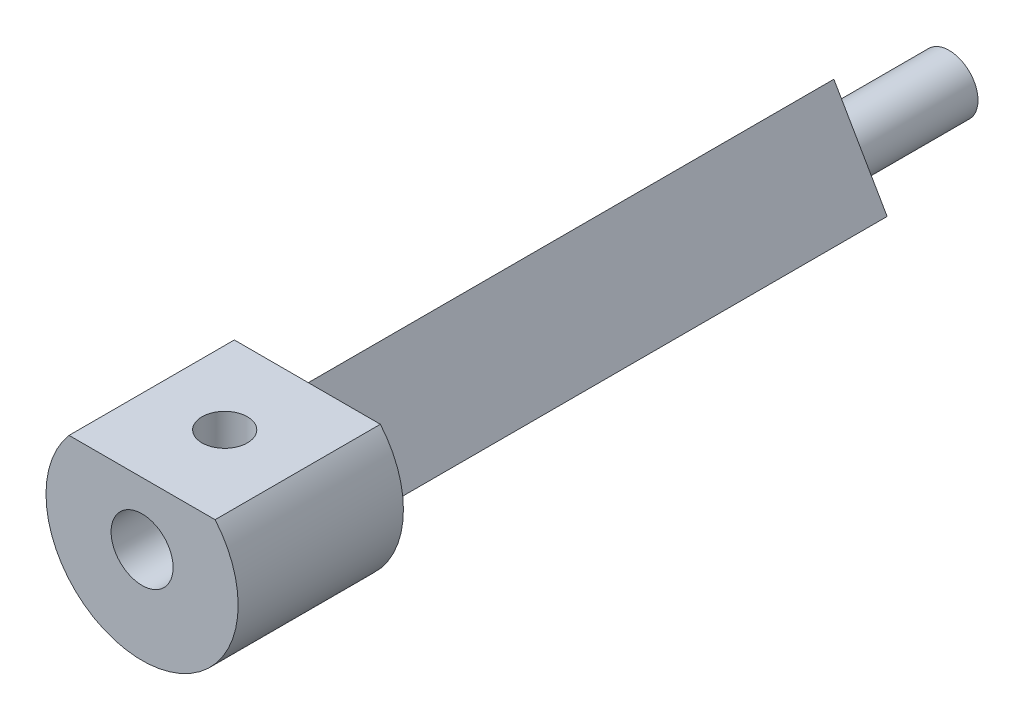
ISO-10303-21;
HEADER;
FILE_DESCRIPTION(('STEP AP214'),'2;1');
FILE_NAME('part.step','',(''),(''),'','','');
FILE_SCHEMA(('AUTOMOTIVE_DESIGN { 1 0 10303 214 1 1 1 1 }'));
ENDSEC;
DATA;
#1=APPLICATION_CONTEXT('core data for automotive mechanical design processes');
#2=APPLICATION_PROTOCOL_DEFINITION('international standard','automotive_design',2000,#1);
#3=PRODUCT_CONTEXT('',#1,'mechanical');
#4=PRODUCT('Part','Part','',(#3));
#5=PRODUCT_RELATED_PRODUCT_CATEGORY('part','',(#4));
#6=PRODUCT_DEFINITION_FORMATION('','',#4);
#7=PRODUCT_DEFINITION_CONTEXT('part definition',#1,'design');
#8=PRODUCT_DEFINITION('design','',#6,#7);
#9=PRODUCT_DEFINITION_SHAPE('','',#8);
#10=(LENGTH_UNIT() NAMED_UNIT(*) SI_UNIT(.MILLI.,.METRE.));
#11=(NAMED_UNIT(*) PLANE_ANGLE_UNIT() SI_UNIT($,.RADIAN.));
#12=(NAMED_UNIT(*) SI_UNIT($,.STERADIAN.) SOLID_ANGLE_UNIT());
#13=UNCERTAINTY_MEASURE_WITH_UNIT(LENGTH_MEASURE(1.E-05),#10,'distance_accuracy_value','');
#14=(GEOMETRIC_REPRESENTATION_CONTEXT(3) GLOBAL_UNCERTAINTY_ASSIGNED_CONTEXT((#13)) GLOBAL_UNIT_ASSIGNED_CONTEXT((#10,
#11,#12)) REPRESENTATION_CONTEXT('',''));
#15=CARTESIAN_POINT('',(0.,0.,0.));
#16=DIRECTION('',(0.,0.,1.));
#17=DIRECTION('',(1.,0.,0.));
#18=AXIS2_PLACEMENT_3D('',#15,#16,#17);
#19=CARTESIAN_POINT('',(0.,0.,0.));
#20=DIRECTION('',(0.,0.,1.));
#21=DIRECTION('',(1.,0.,0.));
#22=AXIS2_PLACEMENT_3D('',#19,#20,#21);
#23=PLANE('',#22);
#24=CARTESIAN_POINT('',(0.,0.,0.));
#25=DIRECTION('',(0.,0.,1.));
#26=DIRECTION('',(1.,0.,0.));
#27=AXIS2_PLACEMENT_3D('',#24,#25,#26);
#28=CIRCLE('',#27,6.35);
#29=CARTESIAN_POINT('',(-4.82609120903845,4.12690485013185,0.));
#30=VERTEX_POINT('',#29);
#31=CARTESIAN_POINT('',(4.82609120903845,4.12690485013185,0.));
#32=VERTEX_POINT('',#31);
#33=EDGE_CURVE('E143',#30,#32,#28,.T.);
#34=ORIENTED_EDGE('',*,*,#33,.F.);
#35=DIRECTION('',(1.,0.,0.));
#36=VECTOR('',#35,1.);
#37=CARTESIAN_POINT('',(0.,4.12690485013185,0.));
#38=LINE('',#37,#36);
#39=EDGE_CURVE('E54',#30,#32,#38,.T.);
#40=ORIENTED_EDGE('',*,*,#39,.T.);
#41=EDGE_LOOP('',(#34,#40));
#42=FACE_BOUND('',#41,.T.);
#43=DIRECTION('',(0.5,0.866025403784439,0.));
#44=VECTOR('',#43,1.);
#45=CARTESIAN_POINT('',(-3.51952724097996,-2.032,0.));
#46=LINE('',#45,#44);
#47=CARTESIAN_POINT('',(-3.51952724097996,-2.032,0.));
#48=VERTEX_POINT('',#47);
#49=CARTESIAN_POINT('',(0.,4.064,0.));
#50=VERTEX_POINT('',#49);
#51=EDGE_CURVE('E62',#48,#50,#46,.T.);
#52=ORIENTED_EDGE('',*,*,#51,.F.);
#53=DIRECTION('',(-1.,0.,0.));
#54=VECTOR('',#53,1.);
#55=CARTESIAN_POINT('',(3.51952724097996,-2.032,0.));
#56=LINE('',#55,#54);
#57=CARTESIAN_POINT('',(3.51952724097996,-2.032,0.));
#58=VERTEX_POINT('',#57);
#59=EDGE_CURVE('E111',#58,#48,#56,.T.);
#60=ORIENTED_EDGE('',*,*,#59,.F.);
#61=DIRECTION('',(0.5,-0.866025403784439,0.));
#62=VECTOR('',#61,1.);
#63=CARTESIAN_POINT('',(0.,4.064,0.));
#64=LINE('',#63,#62);
#65=EDGE_CURVE('E66',#50,#58,#64,.T.);
#66=ORIENTED_EDGE('',*,*,#65,.F.);
#67=EDGE_LOOP('',(#52,#60,#66));
#68=FACE_BOUND('',#67,.T.);
#69=ADVANCED_FACE('F39',(#42,#68),#23,.F.);
#70=CARTESIAN_POINT('',(0.,0.,10.922));
#71=DIRECTION('',(0.,0.,-1.));
#72=DIRECTION('',(-1.,0.,0.));
#73=AXIS2_PLACEMENT_3D('',#70,#71,#72);
#74=CYLINDRICAL_SURFACE('',#73,6.35);
#75=CARTESIAN_POINT('',(0.,0.,10.922));
#76=DIRECTION('',(0.,0.,1.));
#77=DIRECTION('',(1.,0.,0.));
#78=AXIS2_PLACEMENT_3D('',#75,#76,#77);
#79=CIRCLE('',#78,6.35);
#80=CARTESIAN_POINT('',(-4.82609120903845,4.12690485013185,10.922));
#81=VERTEX_POINT('',#80);
#82=CARTESIAN_POINT('',(4.82609120903845,4.12690485013185,10.922));
#83=VERTEX_POINT('',#82);
#84=EDGE_CURVE('E144',#81,#83,#79,.T.);
#85=ORIENTED_EDGE('',*,*,#84,.F.);
#86=DIRECTION('',(0.,0.,1.));
#87=VECTOR('',#86,1.);
#88=CARTESIAN_POINT('',(-4.82609120903845,4.12690485013185,-4.318));
#89=LINE('',#88,#87);
#90=EDGE_CURVE('E136',#30,#81,#89,.T.);
#91=ORIENTED_EDGE('',*,*,#90,.F.);
#92=ORIENTED_EDGE('',*,*,#33,.T.);
#93=DIRECTION('',(0.,0.,-1.));
#94=VECTOR('',#93,1.);
#95=CARTESIAN_POINT('',(4.82609120903845,4.12690485013185,10.922));
#96=LINE('',#95,#94);
#97=EDGE_CURVE('E139',#32,#83,#96,.F.);
#98=ORIENTED_EDGE('',*,*,#97,.T.);
#99=EDGE_LOOP('',(#85,#91,#92,#98));
#100=FACE_BOUND('',#99,.T.);
#101=ADVANCED_FACE('F41',(#100),#74,.T.);
#102=CARTESIAN_POINT('',(0.,0.,10.922));
#103=DIRECTION('',(0.,0.,1.));
#104=DIRECTION('',(1.,0.,0.));
#105=AXIS2_PLACEMENT_3D('',#102,#103,#104);
#106=PLANE('',#105);
#107=CARTESIAN_POINT('',(0.,0.,10.922));
#108=DIRECTION('',(0.,0.,1.));
#109=DIRECTION('',(1.,0.,0.));
#110=AXIS2_PLACEMENT_3D('',#107,#108,#109);
#111=CIRCLE('',#110,2.05);
#112=CARTESIAN_POINT('',(2.05,0.,10.922));
#113=VERTEX_POINT('',#112);
#114=EDGE_CURVE('E115',#113,#113,#111,.T.);
#115=ORIENTED_EDGE('',*,*,#114,.F.);
#116=EDGE_LOOP('',(#115));
#117=FACE_BOUND('',#116,.T.);
#118=DIRECTION('',(1.,0.,0.));
#119=VECTOR('',#118,1.);
#120=CARTESIAN_POINT('',(-4.82609120903845,4.12690485013185,10.922));
#121=LINE('',#120,#119);
#122=EDGE_CURVE('E133',#81,#83,#121,.T.);
#123=ORIENTED_EDGE('',*,*,#122,.F.);
#124=ORIENTED_EDGE('',*,*,#84,.T.);
#125=EDGE_LOOP('',(#123,#124));
#126=FACE_BOUND('',#125,.T.);
#127=ADVANCED_FACE('F161',(#117,#126),#106,.T.);
#128=CARTESIAN_POINT('',(-4.82609120903845,4.12690485013185,-4.318));
#129=DIRECTION('',(0.,-1.,0.));
#130=DIRECTION('',(0.,0.,-1.));
#131=AXIS2_PLACEMENT_3D('',#128,#129,#130);
#132=PLANE('',#131);
#133=CARTESIAN_POINT('',(0.,4.12690485013185,5.461));
#134=DIRECTION('',(0.,1.,0.));
#135=DIRECTION('',(0.,0.,1.));
#136=AXIS2_PLACEMENT_3D('',#133,#134,#135);
#137=CIRCLE('',#136,1.5);
#138=CARTESIAN_POINT('',(0.,4.12690485013185,6.961));
#139=VERTEX_POINT('',#138);
#140=EDGE_CURVE('E129',#139,#139,#137,.T.);
#141=ORIENTED_EDGE('',*,*,#140,.F.);
#142=EDGE_LOOP('',(#141));
#143=FACE_BOUND('',#142,.T.);
#144=ORIENTED_EDGE('',*,*,#39,.F.);
#145=ORIENTED_EDGE('',*,*,#90,.T.);
#146=ORIENTED_EDGE('',*,*,#122,.T.);
#147=ORIENTED_EDGE('',*,*,#97,.F.);
#148=EDGE_LOOP('',(#144,#145,#146,#147));
#149=FACE_BOUND('',#148,.T.);
#150=ADVANCED_FACE('F159',(#143,#149),#132,.F.);
#151=CARTESIAN_POINT('',(0.,-0.953095149868148,5.461));
#152=DIRECTION('',(0.,1.,0.));
#153=DIRECTION('',(0.,0.,1.));
#154=AXIS2_PLACEMENT_3D('',#151,#152,#153);
#155=CYLINDRICAL_SURFACE('',#154,1.5);
#156=CARTESIAN_POINT('',(0.,2.05,6.961));
#157=CARTESIAN_POINT('',(-0.0736645541699376,2.04999557455054,6.96099536487032));
#158=CARTESIAN_POINT('',(-0.147451361580434,2.04598708706443,6.95552985480854));
#159=CARTESIAN_POINT('',(-0.292720171427361,2.03031628176041,6.93400264589157));
#160=CARTESIAN_POINT('',(-0.364195790279562,2.01863439721989,6.91791385773748));
#161=CARTESIAN_POINT('',(-0.502351269043641,1.98874583853753,6.87621015882617));
#162=CARTESIAN_POINT('',(-0.569056984261829,1.97057814890178,6.85065213123984));
#163=CARTESIAN_POINT('',(-0.696820466780421,1.92910828401678,6.79119240013698));
#164=CARTESIAN_POINT('',(-0.757879974929624,1.90580769889566,6.75729328024158));
#165=CARTESIAN_POINT('',(-0.878974600164129,1.85327996587474,6.67881635944393));
#166=CARTESIAN_POINT('',(-0.938407453909167,1.82370598176577,6.63354625481528));
#167=CARTESIAN_POINT('',(-1.04935746875454,1.76220961079271,6.53540515478497));
#168=CARTESIAN_POINT('',(-1.10086192304519,1.73028357291087,6.48252221546021));
#169=CARTESIAN_POINT('',(-1.20473615097505,1.66004618595591,6.35896326977443));
#170=CARTESIAN_POINT('',(-1.25534711008369,1.62169397672011,6.28682405496822));
#171=CARTESIAN_POINT('',(-1.34385567293754,1.54913319052267,6.13322299041084));
#172=CARTESIAN_POINT('',(-1.38177233083954,1.5149184529776,6.05177536135073));
#173=CARTESIAN_POINT('',(-1.43291459132733,1.46631010290269,5.90871456900897));
#174=CARTESIAN_POINT('',(-1.45015813606169,1.4491081113302,5.84950503166973));
#175=CARTESIAN_POINT('',(-1.47735605187029,1.42137280086756,5.72798008652806));
#176=CARTESIAN_POINT('',(-1.4873267292953,1.41082457094183,5.66567196341169));
#177=CARTESIAN_POINT('',(-1.49933424266877,1.39806424591683,5.53891666053465));
#178=CARTESIAN_POINT('',(-1.50131036964724,1.39591594223184,5.4744568470837));
#179=CARTESIAN_POINT('',(-1.49697487005051,1.40056141611663,5.34612505475285));
#180=CARTESIAN_POINT('',(-1.49065746079277,1.40736143292628,5.28225351733047));
#181=CARTESIAN_POINT('',(-1.46914421467263,1.42981581835315,5.15023178006344));
#182=CARTESIAN_POINT('',(-1.45304431394653,1.44636569534487,5.0823888526529));
#183=CARTESIAN_POINT('',(-1.41241800405743,1.48606089204735,4.95128361752539));
#184=CARTESIAN_POINT('',(-1.38787183385895,1.50922165684335,4.88803247688767));
#185=CARTESIAN_POINT('',(-1.32149425773126,1.56803362426462,4.7456054484429));
#186=CARTESIAN_POINT('',(-1.27662069854312,1.605233434408,4.66849468218742));
#187=CARTESIAN_POINT('',(-1.17456012669744,1.68136246377685,4.5238485386396));
#188=CARTESIAN_POINT('',(-1.1173592530454,1.72029359028535,4.45632408326575));
#189=CARTESIAN_POINT('',(-0.990371112630744,1.79644834867789,4.33085179892645));
#190=CARTESIAN_POINT('',(-0.920423005713052,1.83364149644171,4.27304695505277));
#191=CARTESIAN_POINT('',(-0.76926800522842,1.90199023539516,4.17005319594615));
#192=CARTESIAN_POINT('',(-0.688087552764536,1.9331596052877,4.12483538234152));
#193=CARTESIAN_POINT('',(-0.538207436597272,1.97922123004423,4.05914062240448));
#194=CARTESIAN_POINT('',(-0.471634462119273,1.99623772718083,4.03529332526308));
#195=CARTESIAN_POINT('',(-0.334527315040303,2.02372535847694,3.99705216140614));
#196=CARTESIAN_POINT('',(-0.263996112133561,2.03420133002224,3.98265130768186));
#197=CARTESIAN_POINT('',(-0.12060014532572,2.04772049374847,3.96410319342416));
#198=CARTESIAN_POINT('',(-0.0477275087898625,2.05073519152121,3.95999524047133));
#199=CARTESIAN_POINT('',(0.0977467281938168,2.04895968464559,3.96242177556858));
#200=CARTESIAN_POINT('',(0.170348323545057,2.04416933396684,3.96895646273962));
#201=CARTESIAN_POINT('',(0.30872436576349,2.02774746830803,3.99153937748139));
#202=CARTESIAN_POINT('',(0.374648148974852,2.01653935117606,4.00699926266328));
#203=CARTESIAN_POINT('',(0.502713167981761,1.98848713080471,4.04616175245188));
#204=CARTESIAN_POINT('',(0.56485361051893,1.97164185039048,4.06986607873626));
#205=CARTESIAN_POINT('',(0.689132816852741,1.9318878201279,4.12678136118287));
#206=CARTESIAN_POINT('',(0.750866850830906,1.90859948458405,4.16060507457239));
#207=CARTESIAN_POINT('',(0.867968847215971,1.85827866471816,4.2356532538988));
#208=CARTESIAN_POINT('',(0.923332753094364,1.83124381848865,4.27688239332167));
#209=CARTESIAN_POINT('',(1.03682397286532,1.76985341439226,4.37400685825464));
#210=CARTESIAN_POINT('',(1.09360081170611,1.73506384496132,4.43120532182986));
#211=CARTESIAN_POINT('',(1.19731087491147,1.66518962228043,4.55385800989506));
#212=CARTESIAN_POINT('',(1.24423528561181,1.6301047337781,4.61931954316177));
#213=CARTESIAN_POINT('',(1.32312902288905,1.56656120372554,4.7506770634843));
#214=CARTESIAN_POINT('',(1.35615882476119,1.53779480627221,4.81578433714041));
#215=CARTESIAN_POINT('',(1.41291272063144,1.48581938303921,4.95198740743026));
#216=CARTESIAN_POINT('',(1.43665621646698,1.46259881036972,5.02307033727716));
#217=CARTESIAN_POINT('',(1.46935149073412,1.42965818089487,5.15366776876887));
#218=CARTESIAN_POINT('',(1.48043349891081,1.41807300341028,5.21216597985044));
#219=CARTESIAN_POINT('',(1.49555161797816,1.40212425294941,5.3310034275123));
#220=CARTESIAN_POINT('',(1.49959826077462,1.39774988593686,5.39133977438546));
#221=CARTESIAN_POINT('',(1.5003451977955,1.3969485321308,5.51224125605514));
#222=CARTESIAN_POINT('',(1.49703007298041,1.4005382258501,5.57280660530966));
#223=CARTESIAN_POINT('',(1.48329148070309,1.41507599115702,5.69224363534277));
#224=CARTESIAN_POINT('',(1.47285823479779,1.42603418484414,5.75111287000658));
#225=CARTESIAN_POINT('',(1.44154573019903,1.45776156448447,5.88260815870621));
#226=CARTESIAN_POINT('',(1.41850812555957,1.48045941002889,5.95424268872673));
#227=CARTESIAN_POINT('',(1.36303990157746,1.53168111814911,6.09158590116442));
#228=CARTESIAN_POINT('',(1.33058477026104,1.56022012626716,6.1572785250729));
#229=CARTESIAN_POINT('',(1.24746944408314,1.62785001356672,6.29899881911067));
#230=CARTESIAN_POINT('',(1.19426424774973,1.6677337957351,6.37315634501248));
#231=CARTESIAN_POINT('',(1.07522193889443,1.74685731312829,6.51084071490974));
#232=CARTESIAN_POINT('',(1.00939267395049,1.78609743211258,6.57437411755238));
#233=CARTESIAN_POINT('',(0.877107798536325,1.85413298021575,6.68029193666004));
#234=CARTESIAN_POINT('',(0.812406788660301,1.88359794901534,6.72443243761176));
#235=CARTESIAN_POINT('',(0.675157460670324,1.93702407432252,6.80278399156384));
#236=CARTESIAN_POINT('',(0.602617105963951,1.96099074025875,6.83700499327855));
#237=CARTESIAN_POINT('',(0.462317192011558,1.99830790110585,6.88964391198433));
#238=CARTESIAN_POINT('',(0.395431009217102,2.01270292850566,6.90964837926339));
#239=CARTESIAN_POINT('',(0.258550164418269,2.0348035590171,6.94020215510696));
#240=CARTESIAN_POINT('',(0.188564056942657,2.04252649622795,6.95077596685669));
#241=CARTESIAN_POINT('',(0.0984524426773341,2.04772982798432,6.95789598733901));
#242=CARTESIAN_POINT('',(0.0787929080878813,2.048579801482,6.9590585851658));
#243=CARTESIAN_POINT('',(0.0394251721090294,2.04971551310578,6.96061125748875));
#244=CARTESIAN_POINT('',(0.0197169652405603,2.05000118451044,6.96100124063319));
#245=CARTESIAN_POINT('',(0.,2.05,6.961));
#246=B_SPLINE_CURVE_WITH_KNOTS('',3,(#156,#157,#158,#159,#160,#161,#162,#163,#164,#165,#166,
#167,#168,#169,#170,#171,#172,#173,#174,#175,#176,#177,#178,#179,#180,#181,#182,#183,#184,#185,
#186,#187,#188,#189,#190,#191,#192,#193,#194,#195,#196,#197,#198,#199,#200,#201,#202,#203,#204,
#205,#206,#207,#208,#209,#210,#211,#212,#213,#214,#215,#216,#217,#218,#219,#220,#221,#222,#223,
#224,#225,#226,#227,#228,#229,#230,#231,#232,#233,#234,#235,#236,#237,#238,#239,#240,#241,#242,
#243,#244,#245),.UNSPECIFIED.,.T.,.F.,(4,2,2,2,2,2,2,2,2,2,2,2,2,2,2,2,2,2,2,2,2,2,2,2,2,2,2,2,
2,2,2,2,2,2,2,2,2,2,2,2,2,2,2,2,4),(0.,0.220907485233337,0.442380470099748,0.662544051909396,
0.882639524557006,1.12282543414092,1.3633923681998,1.65048137899578,1.93713751648741,
2.12853026601187,2.31949256748167,2.51190230585804,2.70444627353801,2.91826981751639,
3.1325970669765,3.42110394211627,3.70993692667695,4.00270445801705,4.29479417832145,
4.51209357641629,4.72923206846164,4.9471985358974,5.16516908147474,5.37018833492614,
5.57525042805759,5.79685909676791,6.01860811491735,6.28096376393172,6.54355311721224,
6.77817738021138,7.01230879117284,7.19352509569974,7.37446988601036,7.55579401806688,
7.73736774510938,7.97186478758937,8.20697774023452,8.50435399328344,8.8015459822408,
9.05161167557908,9.30142569199743,9.51438706522724,9.72679348624617,9.7859143260036,
9.84504215561996),.UNSPECIFIED.);
#247=CARTESIAN_POINT('',(0.,2.05,6.961));
#248=VERTEX_POINT('',#247);
#249=EDGE_CURVE('E43',#248,#248,#246,.T.);
#250=ORIENTED_EDGE('',*,*,#249,.T.);
#251=EDGE_LOOP('',(#250));
#252=FACE_BOUND('',#251,.T.);
#253=ORIENTED_EDGE('',*,*,#140,.T.);
#254=EDGE_LOOP('',(#253));
#255=FACE_BOUND('',#254,.T.);
#256=ADVANCED_FACE('F169',(#252,#255),#155,.F.);
#257=CARTESIAN_POINT('',(0.,0.,0.761999999999999));
#258=DIRECTION('',(0.,0.,1.));
#259=DIRECTION('',(1.,0.,0.));
#260=AXIS2_PLACEMENT_3D('',#257,#258,#259);
#261=CYLINDRICAL_SURFACE('',#260,2.05);
#262=ORIENTED_EDGE('',*,*,#114,.T.);
#263=EDGE_LOOP('',(#262));
#264=FACE_BOUND('',#263,.T.);
#265=CARTESIAN_POINT('',(0.,0.,0.761999999999999));
#266=DIRECTION('',(0.,0.,1.));
#267=DIRECTION('',(1.,0.,0.));
#268=AXIS2_PLACEMENT_3D('',#265,#266,#267);
#269=CIRCLE('',#268,2.05);
#270=CARTESIAN_POINT('',(2.05,0.,0.761999999999999));
#271=VERTEX_POINT('',#270);
#272=EDGE_CURVE('E120',#271,#271,#269,.T.);
#273=ORIENTED_EDGE('',*,*,#272,.F.);
#274=EDGE_LOOP('',(#273));
#275=FACE_BOUND('',#274,.T.);
#276=ORIENTED_EDGE('',*,*,#249,.F.);
#277=EDGE_LOOP('',(#276));
#278=FACE_BOUND('',#277,.T.);
#279=ADVANCED_FACE('F201',(#264,#275,#278),#261,.F.);
#280=CARTESIAN_POINT('',(0.,0.,0.761999999999999));
#281=DIRECTION('',(0.,0.,1.));
#282=DIRECTION('',(1.,0.,0.));
#283=AXIS2_PLACEMENT_3D('',#280,#281,#282);
#284=PLANE('',#283);
#285=ORIENTED_EDGE('',*,*,#272,.T.);
#286=EDGE_LOOP('',(#285));
#287=FACE_BOUND('',#286,.T.);
#288=ADVANCED_FACE('F209',(#287),#284,.T.);
#289=CARTESIAN_POINT('',(-3.51952724097996,-2.032,-34.798));
#290=DIRECTION('',(0.866025403784439,-0.5,0.));
#291=DIRECTION('',(0.5,0.866025403784439,0.));
#292=AXIS2_PLACEMENT_3D('',#289,#290,#291);
#293=PLANE('',#292);
#294=ORIENTED_EDGE('',*,*,#51,.T.);
#295=DIRECTION('',(0.,0.,1.));
#296=VECTOR('',#295,1.);
#297=CARTESIAN_POINT('',(0.,4.064,-34.798));
#298=LINE('',#297,#296);
#299=CARTESIAN_POINT('',(0.,4.064,-34.798));
#300=VERTEX_POINT('',#299);
#301=EDGE_CURVE('E96',#300,#50,#298,.T.);
#302=ORIENTED_EDGE('',*,*,#301,.F.);
#303=DIRECTION('',(0.5,0.866025403784439,0.));
#304=VECTOR('',#303,1.);
#305=CARTESIAN_POINT('',(-3.51952724097996,-2.032,-34.798));
#306=LINE('',#305,#304);
#307=CARTESIAN_POINT('',(-3.51952724097996,-2.032,-34.798));
#308=VERTEX_POINT('',#307);
#309=EDGE_CURVE('E103',#308,#300,#306,.T.);
#310=ORIENTED_EDGE('',*,*,#309,.F.);
#311=DIRECTION('',(0.,0.,1.));
#312=VECTOR('',#311,1.);
#313=CARTESIAN_POINT('',(-3.51952724097996,-2.032,-34.798));
#314=LINE('',#313,#312);
#315=EDGE_CURVE('E122',#308,#48,#314,.T.);
#316=ORIENTED_EDGE('',*,*,#315,.T.);
#317=EDGE_LOOP('',(#294,#302,#310,#316));
#318=FACE_BOUND('',#317,.T.);
#319=ADVANCED_FACE('F113',(#318),#293,.F.);
#320=CARTESIAN_POINT('',(0.,4.064,-34.798));
#321=DIRECTION('',(-0.866025403784439,-0.5,0.));
#322=DIRECTION('',(0.5,-0.866025403784439,0.));
#323=AXIS2_PLACEMENT_3D('',#320,#321,#322);
#324=PLANE('',#323);
#325=ORIENTED_EDGE('',*,*,#65,.T.);
#326=DIRECTION('',(0.,0.,1.));
#327=VECTOR('',#326,1.);
#328=CARTESIAN_POINT('',(3.51952724097996,-2.032,-34.798));
#329=LINE('',#328,#327);
#330=CARTESIAN_POINT('',(3.51952724097996,-2.032,-34.798));
#331=VERTEX_POINT('',#330);
#332=EDGE_CURVE('E98',#331,#58,#329,.T.);
#333=ORIENTED_EDGE('',*,*,#332,.F.);
#334=DIRECTION('',(0.5,-0.866025403784439,0.));
#335=VECTOR('',#334,1.);
#336=CARTESIAN_POINT('',(0.,4.064,-34.798));
#337=LINE('',#336,#335);
#338=EDGE_CURVE('E92',#300,#331,#337,.T.);
#339=ORIENTED_EDGE('',*,*,#338,.F.);
#340=ORIENTED_EDGE('',*,*,#301,.T.);
#341=EDGE_LOOP('',(#325,#333,#339,#340));
#342=FACE_BOUND('',#341,.T.);
#343=ADVANCED_FACE('F94',(#342),#324,.F.);
#344=CARTESIAN_POINT('',(3.51952724097996,-2.032,-34.798));
#345=DIRECTION('',(0.,1.,0.));
#346=DIRECTION('',(-1.,0.,0.));
#347=AXIS2_PLACEMENT_3D('',#344,#345,#346);
#348=PLANE('',#347);
#349=ORIENTED_EDGE('',*,*,#59,.T.);
#350=ORIENTED_EDGE('',*,*,#315,.F.);
#351=DIRECTION('',(-1.,0.,0.));
#352=VECTOR('',#351,1.);
#353=CARTESIAN_POINT('',(3.51952724097996,-2.032,-34.798));
#354=LINE('',#353,#352);
#355=EDGE_CURVE('E102',#331,#308,#354,.T.);
#356=ORIENTED_EDGE('',*,*,#355,.F.);
#357=ORIENTED_EDGE('',*,*,#332,.T.);
#358=EDGE_LOOP('',(#349,#350,#356,#357));
#359=FACE_BOUND('',#358,.T.);
#360=ADVANCED_FACE('F231',(#359),#348,.F.);
#361=CARTESIAN_POINT('',(0.,0.,-34.798));
#362=DIRECTION('',(0.,0.,-1.));
#363=DIRECTION('',(-1.,0.,0.));
#364=AXIS2_PLACEMENT_3D('',#361,#362,#363);
#365=PLANE('',#364);
#366=CARTESIAN_POINT('',(0.,0.,-34.798));
#367=DIRECTION('',(0.,0.,-1.));
#368=DIRECTION('',(-1.,0.,0.));
#369=AXIS2_PLACEMENT_3D('',#366,#367,#368);
#370=CIRCLE('',#369,1.905);
#371=CARTESIAN_POINT('',(1.905,0.,-34.798));
#372=VERTEX_POINT('',#371);
#373=EDGE_CURVE('E11',#372,#372,#370,.T.);
#374=ORIENTED_EDGE('',*,*,#373,.F.);
#375=EDGE_LOOP('',(#374));
#376=FACE_BOUND('',#375,.T.);
#377=ORIENTED_EDGE('',*,*,#309,.T.);
#378=ORIENTED_EDGE('',*,*,#338,.T.);
#379=ORIENTED_EDGE('',*,*,#355,.T.);
#380=EDGE_LOOP('',(#377,#378,#379));
#381=FACE_BOUND('',#380,.T.);
#382=ADVANCED_FACE('F106',(#376,#381),#365,.T.);
#383=CARTESIAN_POINT('',(0.,0.,-42.418));
#384=DIRECTION('',(0.,0.,1.));
#385=DIRECTION('',(1.,0.,0.));
#386=AXIS2_PLACEMENT_3D('',#383,#384,#385);
#387=CYLINDRICAL_SURFACE('',#386,1.905);
#388=CARTESIAN_POINT('',(0.,0.,-42.418));
#389=DIRECTION('',(0.,0.,-1.));
#390=DIRECTION('',(-1.,0.,0.));
#391=AXIS2_PLACEMENT_3D('',#388,#389,#390);
#392=CIRCLE('',#391,1.905);
#393=CARTESIAN_POINT('',(1.905,0.,-42.418));
#394=VERTEX_POINT('',#393);
#395=EDGE_CURVE('E282',#394,#394,#392,.T.);
#396=CARTESIAN_POINT('',(1.905,0.,-42.418));
#397=CARTESIAN_POINT('',(1.905,0.,-42.338625));
#398=CARTESIAN_POINT('',(1.905,0.,-42.25925));
#399=CARTESIAN_POINT('',(1.905,0.,-42.1005));
#400=CARTESIAN_POINT('',(1.905,0.,-42.021125));
#401=CARTESIAN_POINT('',(1.905,0.,-41.862375));
#402=CARTESIAN_POINT('',(1.905,0.,-41.783));
#403=CARTESIAN_POINT('',(1.905,0.,-41.62425));
#404=CARTESIAN_POINT('',(1.905,0.,-41.544875));
#405=CARTESIAN_POINT('',(1.905,0.,-41.386125));
#406=CARTESIAN_POINT('',(1.905,0.,-41.30675));
#407=CARTESIAN_POINT('',(1.905,0.,-41.148));
#408=CARTESIAN_POINT('',(1.905,0.,-41.068625));
#409=CARTESIAN_POINT('',(1.905,0.,-40.909875));
#410=CARTESIAN_POINT('',(1.905,0.,-40.8305));
#411=CARTESIAN_POINT('',(1.905,0.,-40.67175));
#412=CARTESIAN_POINT('',(1.905,0.,-40.592375));
#413=CARTESIAN_POINT('',(1.905,0.,-40.433625));
#414=CARTESIAN_POINT('',(1.905,0.,-40.35425));
#415=CARTESIAN_POINT('',(1.905,0.,-40.1955));
#416=CARTESIAN_POINT('',(1.905,0.,-40.116125));
#417=CARTESIAN_POINT('',(1.905,0.,-39.957375));
#418=CARTESIAN_POINT('',(1.905,0.,-39.878));
#419=CARTESIAN_POINT('',(1.905,0.,-39.71925));
#420=CARTESIAN_POINT('',(1.905,0.,-39.639875));
#421=CARTESIAN_POINT('',(1.905,0.,-39.481125));
#422=CARTESIAN_POINT('',(1.905,0.,-39.40175));
#423=CARTESIAN_POINT('',(1.905,0.,-39.243));
#424=CARTESIAN_POINT('',(1.905,0.,-39.163625));
#425=CARTESIAN_POINT('',(1.905,0.,-39.004875));
#426=CARTESIAN_POINT('',(1.905,0.,-38.9255));
#427=CARTESIAN_POINT('',(1.905,0.,-38.76675));
#428=CARTESIAN_POINT('',(1.905,0.,-38.687375));
#429=CARTESIAN_POINT('',(1.905,0.,-38.528625));
#430=CARTESIAN_POINT('',(1.905,0.,-38.44925));
#431=CARTESIAN_POINT('',(1.905,0.,-38.2905));
#432=CARTESIAN_POINT('',(1.905,0.,-38.211125));
#433=CARTESIAN_POINT('',(1.905,0.,-38.052375));
#434=CARTESIAN_POINT('',(1.905,0.,-37.973));
#435=CARTESIAN_POINT('',(1.905,0.,-37.81425));
#436=CARTESIAN_POINT('',(1.905,0.,-37.734875));
#437=CARTESIAN_POINT('',(1.905,0.,-37.576125));
#438=CARTESIAN_POINT('',(1.905,0.,-37.49675));
#439=CARTESIAN_POINT('',(1.905,0.,-37.338));
#440=CARTESIAN_POINT('',(1.905,0.,-37.258625));
#441=CARTESIAN_POINT('',(1.905,0.,-37.099875));
#442=CARTESIAN_POINT('',(1.905,0.,-37.0205));
#443=CARTESIAN_POINT('',(1.905,0.,-36.86175));
#444=CARTESIAN_POINT('',(1.905,0.,-36.782375));
#445=CARTESIAN_POINT('',(1.905,0.,-36.623625));
#446=CARTESIAN_POINT('',(1.905,0.,-36.54425));
#447=CARTESIAN_POINT('',(1.905,0.,-36.3855));
#448=CARTESIAN_POINT('',(1.905,0.,-36.306125));
#449=CARTESIAN_POINT('',(1.905,0.,-36.147375));
#450=CARTESIAN_POINT('',(1.905,0.,-36.068));
#451=CARTESIAN_POINT('',(1.905,0.,-35.90925));
#452=CARTESIAN_POINT('',(1.905,0.,-35.829875));
#453=CARTESIAN_POINT('',(1.905,0.,-35.671125));
#454=CARTESIAN_POINT('',(1.905,0.,-35.59175));
#455=CARTESIAN_POINT('',(1.905,0.,-35.433));
#456=CARTESIAN_POINT('',(1.905,0.,-35.353625));
#457=CARTESIAN_POINT('',(1.905,0.,-35.194875));
#458=CARTESIAN_POINT('',(1.905,0.,-35.1155));
#459=CARTESIAN_POINT('',(1.905,0.,-34.95675));
#460=CARTESIAN_POINT('',(1.905,0.,-34.877375));
#461=CARTESIAN_POINT('',(1.905,0.,-34.798));
#462=B_SPLINE_CURVE_WITH_KNOTS('',3,(#396,#397,#398,#399,#400,#401,#402,#403,#404,#405,#406,
#407,#408,#409,#410,#411,#412,#413,#414,#415,#416,#417,#418,#419,#420,#421,#422,#423,#424,#425,
#426,#427,#428,#429,#430,#431,#432,#433,#434,#435,#436,#437,#438,#439,#440,#441,#442,#443,#444,
#445,#446,#447,#448,#449,#450,#451,#452,#453,#454,#455,#456,#457,#458,#459,#460,#461),
.UNSPECIFIED.,.F.,.F.,(4,2,2,2,2,2,2,2,2,2,2,2,2,2,2,2,2,2,2,2,2,2,2,2,2,2,2,2,2,2,2,2,4),(0.,
0.238125000000006,0.476250000000004,0.714375000000003,0.952500000000002,1.190625,
1.42875000000001,1.66687500000001,1.905,2.143125,2.38125,2.619375,2.85750000000001,3.095625,
3.33375,3.571875,3.81,4.04812500000001,4.28625000000001,4.524375,4.7625,5.000625,
5.23875000000001,5.47687500000001,5.71500000000001,5.953125,6.19125,6.429375,6.66750000000001,
6.90562500000001,7.14375,7.381875,7.62),.UNSPECIFIED.);
#463=EDGE_CURVE('BSEAM245',#394,#372,#462,.T.);
#464=ORIENTED_EDGE('',*,*,#395,.F.);
#465=ORIENTED_EDGE('',*,*,#373,.T.);
#466=ORIENTED_EDGE('',*,*,#463,.T.);
#467=ORIENTED_EDGE('',*,*,#463,.F.);
#468=EDGE_LOOP('',(#464,#466,#465,#467));
#469=FACE_BOUND('',#468,.T.);
#470=ADVANCED_FACE('F245',(#469),#387,.T.);
#471=CARTESIAN_POINT('',(0.,0.,-42.418));
#472=DIRECTION('',(0.,0.,-1.));
#473=DIRECTION('',(-1.,0.,0.));
#474=AXIS2_PLACEMENT_3D('',#471,#472,#473);
#475=PLANE('',#474);
#476=ORIENTED_EDGE('',*,*,#395,.T.);
#477=EDGE_LOOP('',(#476));
#478=FACE_BOUND('',#477,.T.);
#479=ADVANCED_FACE('F253',(#478),#475,.T.);
#480=CLOSED_SHELL('',(#69,#101,#127,#150,#256,#279,#288,#319,#343,#360,#382,#470,#479));
#481=MANIFOLD_SOLID_BREP('B2',#480);
#482=ADVANCED_BREP_SHAPE_REPRESENTATION('',(#18,#481),#14);
#483=SHAPE_DEFINITION_REPRESENTATION(#9,#482);
ENDSEC;
END-ISO-10303-21;
